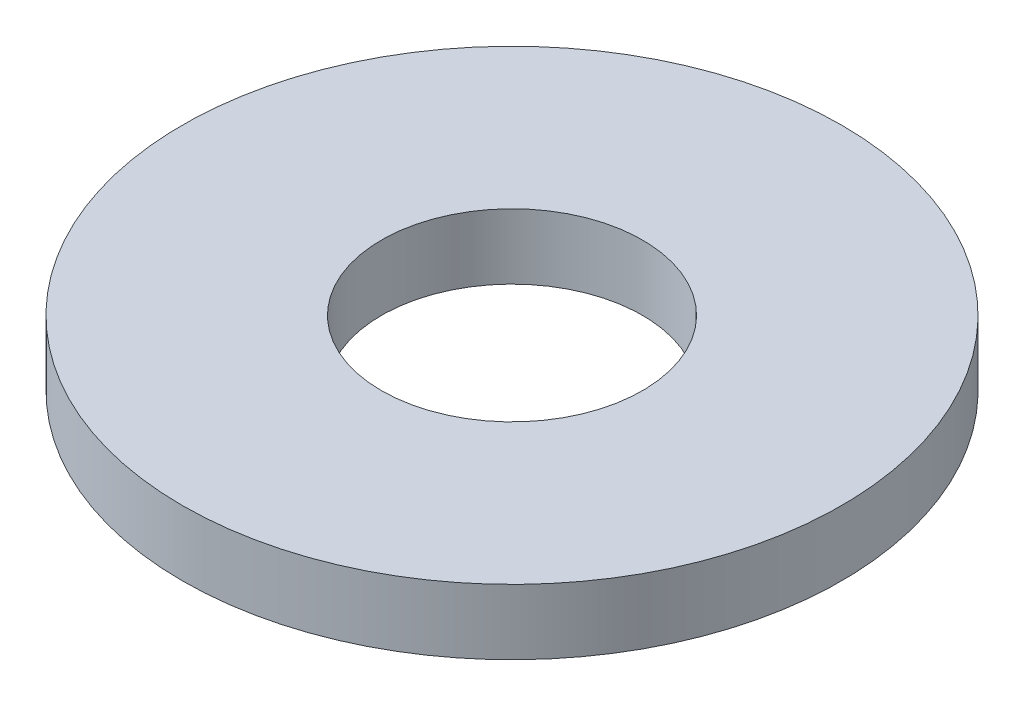
ISO-10303-21;
HEADER;
FILE_DESCRIPTION(('STEP AP214'),'2;1');
FILE_NAME('part.step','',(''),(''),'','','');
FILE_SCHEMA(('AUTOMOTIVE_DESIGN { 1 0 10303 214 1 1 1 1 }'));
ENDSEC;
DATA;
#1=APPLICATION_CONTEXT('core data for automotive mechanical design processes');
#2=APPLICATION_PROTOCOL_DEFINITION('international standard','automotive_design',2000,#1);
#3=PRODUCT_CONTEXT('',#1,'mechanical');
#4=PRODUCT('Part','Part','',(#3));
#5=PRODUCT_RELATED_PRODUCT_CATEGORY('part','',(#4));
#6=PRODUCT_DEFINITION_FORMATION('','',#4);
#7=PRODUCT_DEFINITION_CONTEXT('part definition',#1,'design');
#8=PRODUCT_DEFINITION('design','',#6,#7);
#9=PRODUCT_DEFINITION_SHAPE('','',#8);
#10=(LENGTH_UNIT() NAMED_UNIT(*) SI_UNIT(.MILLI.,.METRE.));
#11=(NAMED_UNIT(*) PLANE_ANGLE_UNIT() SI_UNIT($,.RADIAN.));
#12=(NAMED_UNIT(*) SI_UNIT($,.STERADIAN.) SOLID_ANGLE_UNIT());
#13=UNCERTAINTY_MEASURE_WITH_UNIT(LENGTH_MEASURE(1.E-05),#10,'distance_accuracy_value','');
#14=(GEOMETRIC_REPRESENTATION_CONTEXT(3) GLOBAL_UNCERTAINTY_ASSIGNED_CONTEXT((#13)) GLOBAL_UNIT_ASSIGNED_CONTEXT((#10,
#11,#12)) REPRESENTATION_CONTEXT('',''));
#15=CARTESIAN_POINT('',(0.,0.,0.));
#16=DIRECTION('',(0.,0.,1.));
#17=DIRECTION('',(1.,0.,0.));
#18=AXIS2_PLACEMENT_3D('',#15,#16,#17);
#19=CARTESIAN_POINT('',(0.,1.,0.));
#20=DIRECTION('',(0.,1.,0.));
#21=DIRECTION('',(0.,0.,1.));
#22=AXIS2_PLACEMENT_3D('',#19,#20,#21);
#23=PLANE('',#22);
#24=CARTESIAN_POINT('',(0.,1.,0.));
#25=DIRECTION('',(0.,1.,0.));
#26=DIRECTION('',(0.,0.,1.));
#27=AXIS2_PLACEMENT_3D('',#24,#25,#26);
#28=CIRCLE('',#27,5.05);
#29=CARTESIAN_POINT('',(0.,1.,5.05));
#30=VERTEX_POINT('',#29);
#31=EDGE_CURVE('E10',#30,#30,#28,.T.);
#32=ORIENTED_EDGE('',*,*,#31,.T.);
#33=EDGE_LOOP('',(#32));
#34=FACE_BOUND('',#33,.T.);
#35=CARTESIAN_POINT('',(0.,1.,0.));
#36=DIRECTION('',(0.,1.,0.));
#37=DIRECTION('',(0.,0.,1.));
#38=AXIS2_PLACEMENT_3D('',#35,#36,#37);
#39=CIRCLE('',#38,2.);
#40=CARTESIAN_POINT('',(0.,1.,2.));
#41=VERTEX_POINT('',#40);
#42=EDGE_CURVE('E44',#41,#41,#39,.T.);
#43=ORIENTED_EDGE('',*,*,#42,.F.);
#44=EDGE_LOOP('',(#43));
#45=FACE_BOUND('',#44,.T.);
#46=ADVANCED_FACE('F33',(#34,#45),#23,.T.);
#47=CARTESIAN_POINT('',(0.,0.,0.));
#48=DIRECTION('',(0.,1.,0.));
#49=DIRECTION('',(0.,0.,1.));
#50=AXIS2_PLACEMENT_3D('',#47,#48,#49);
#51=PLANE('',#50);
#52=CARTESIAN_POINT('',(0.,0.,0.));
#53=DIRECTION('',(0.,1.,0.));
#54=DIRECTION('',(0.,0.,1.));
#55=AXIS2_PLACEMENT_3D('',#52,#53,#54);
#56=CIRCLE('',#55,5.05);
#57=CARTESIAN_POINT('',(0.,0.,5.05));
#58=VERTEX_POINT('',#57);
#59=EDGE_CURVE('E37',#58,#58,#56,.T.);
#60=ORIENTED_EDGE('',*,*,#59,.F.);
#61=EDGE_LOOP('',(#60));
#62=FACE_BOUND('',#61,.T.);
#63=CARTESIAN_POINT('',(0.,0.,0.));
#64=DIRECTION('',(0.,1.,0.));
#65=DIRECTION('',(0.,0.,1.));
#66=AXIS2_PLACEMENT_3D('',#63,#64,#65);
#67=CIRCLE('',#66,2.);
#68=CARTESIAN_POINT('',(0.,0.,2.));
#69=VERTEX_POINT('',#68);
#70=EDGE_CURVE('E46',#69,#69,#67,.T.);
#71=ORIENTED_EDGE('',*,*,#70,.T.);
#72=EDGE_LOOP('',(#71));
#73=FACE_BOUND('',#72,.T.);
#74=ADVANCED_FACE('F56',(#62,#73),#51,.F.);
#75=CARTESIAN_POINT('',(0.,1.,0.));
#76=DIRECTION('',(0.,-1.,0.));
#77=DIRECTION('',(0.,0.,-1.));
#78=AXIS2_PLACEMENT_3D('',#75,#76,#77);
#79=CYLINDRICAL_SURFACE('',#78,5.05);
#80=ORIENTED_EDGE('',*,*,#31,.F.);
#81=EDGE_LOOP('',(#80));
#82=FACE_BOUND('',#81,.T.);
#83=ORIENTED_EDGE('',*,*,#59,.T.);
#84=EDGE_LOOP('',(#83));
#85=FACE_BOUND('',#84,.T.);
#86=ADVANCED_FACE('F35',(#82,#85),#79,.T.);
#87=CARTESIAN_POINT('',(0.,1.,0.));
#88=DIRECTION('',(0.,-1.,0.));
#89=DIRECTION('',(0.,0.,-1.));
#90=AXIS2_PLACEMENT_3D('',#87,#88,#89);
#91=CYLINDRICAL_SURFACE('',#90,2.);
#92=ORIENTED_EDGE('',*,*,#42,.T.);
#93=EDGE_LOOP('',(#92));
#94=FACE_BOUND('',#93,.T.);
#95=ORIENTED_EDGE('',*,*,#70,.F.);
#96=EDGE_LOOP('',(#95));
#97=FACE_BOUND('',#96,.T.);
#98=ADVANCED_FACE('F52',(#94,#97),#91,.F.);
#99=CLOSED_SHELL('',(#46,#74,#86,#98));
#100=MANIFOLD_SOLID_BREP('B2',#99);
#101=ADVANCED_BREP_SHAPE_REPRESENTATION('',(#18,#100),#14);
#102=SHAPE_DEFINITION_REPRESENTATION(#9,#101);
ENDSEC;
END-ISO-10303-21;
